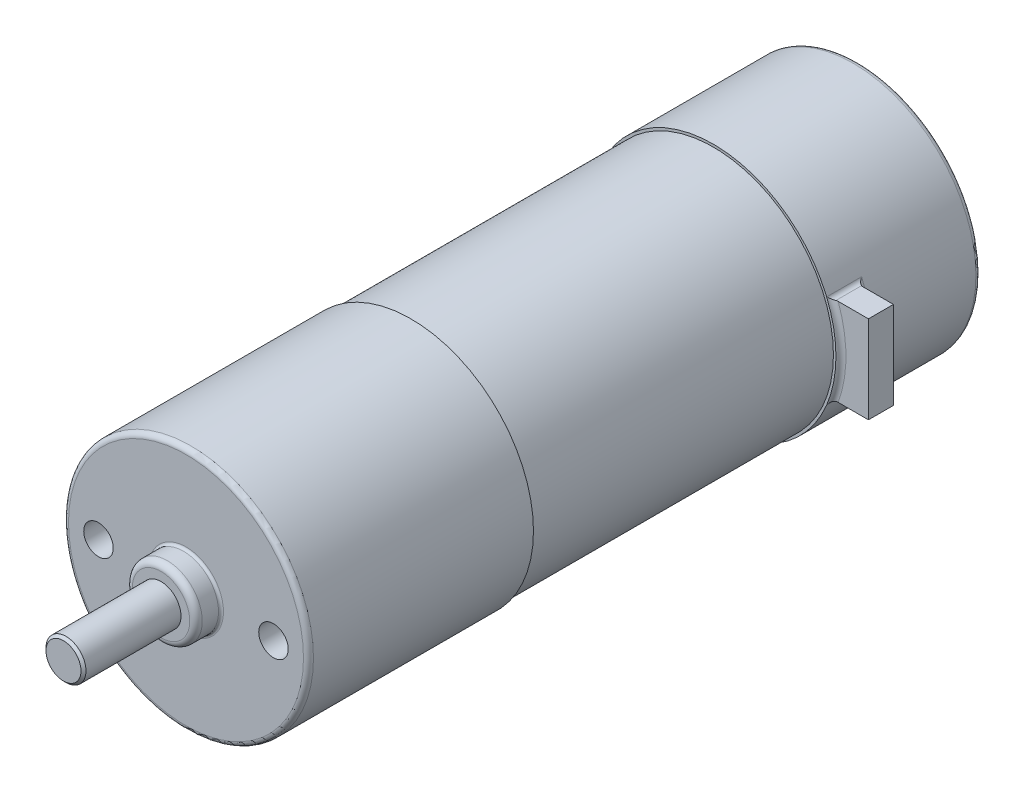
ISO-10303-21;
HEADER;
FILE_DESCRIPTION(('STEP AP214'),'2;1');
FILE_NAME('part.step','',(''),(''),'','','');
FILE_SCHEMA(('AUTOMOTIVE_DESIGN { 1 0 10303 214 1 1 1 1 }'));
ENDSEC;
DATA;
#1=APPLICATION_CONTEXT('core data for automotive mechanical design processes');
#2=APPLICATION_PROTOCOL_DEFINITION('international standard','automotive_design',2000,#1);
#3=PRODUCT_CONTEXT('',#1,'mechanical');
#4=PRODUCT('Part','Part','',(#3));
#5=PRODUCT_RELATED_PRODUCT_CATEGORY('part','',(#4));
#6=PRODUCT_DEFINITION_FORMATION('','',#4);
#7=PRODUCT_DEFINITION_CONTEXT('part definition',#1,'design');
#8=PRODUCT_DEFINITION('design','',#6,#7);
#9=PRODUCT_DEFINITION_SHAPE('','',#8);
#10=(LENGTH_UNIT() NAMED_UNIT(*) SI_UNIT(.MILLI.,.METRE.));
#11=(NAMED_UNIT(*) PLANE_ANGLE_UNIT() SI_UNIT($,.RADIAN.));
#12=(NAMED_UNIT(*) SI_UNIT($,.STERADIAN.) SOLID_ANGLE_UNIT());
#13=UNCERTAINTY_MEASURE_WITH_UNIT(LENGTH_MEASURE(1.E-05),#10,'distance_accuracy_value','');
#14=(GEOMETRIC_REPRESENTATION_CONTEXT(3) GLOBAL_UNCERTAINTY_ASSIGNED_CONTEXT((#13)) GLOBAL_UNIT_ASSIGNED_CONTEXT((#10,
#11,#12)) REPRESENTATION_CONTEXT('',''));
#15=CARTESIAN_POINT('',(0.,0.,0.));
#16=DIRECTION('',(0.,0.,1.));
#17=DIRECTION('',(1.,0.,0.));
#18=AXIS2_PLACEMENT_3D('',#15,#16,#17);
#19=CARTESIAN_POINT('',(0.,0.,-68.326));
#20=DIRECTION('',(0.,0.,1.));
#21=DIRECTION('',(-1.,0.,0.));
#22=AXIS2_PLACEMENT_3D('',#19,#20,#21);
#23=CYLINDRICAL_SURFACE('',#22,12.446);
#24=CARTESIAN_POINT('',(0.,0.,-53.594));
#25=DIRECTION('',(0.,0.,1.));
#26=DIRECTION('',(1.,0.,0.));
#27=AXIS2_PLACEMENT_3D('',#24,#25,#26);
#28=CIRCLE('',#27,12.446);
#29=CARTESIAN_POINT('',(11.5003075817149,4.75876470588235,-53.594));
#30=VERTEX_POINT('',#29);
#31=CARTESIAN_POINT('',(11.5003075817149,-4.75876470588235,-53.594));
#32=VERTEX_POINT('',#31);
#33=EDGE_CURVE('E163',#30,#32,#28,.T.);
#34=ORIENTED_EDGE('',*,*,#33,.F.);
#35=DIRECTION('',(0.,0.,1.));
#36=VECTOR('',#35,1.);
#37=CARTESIAN_POINT('',(11.5003075817149,4.75876470588235,-68.326));
#38=LINE('',#37,#36);
#39=CARTESIAN_POINT('',(11.5003075817149,4.75876470588235,-57.15));
#40=VERTEX_POINT('',#39);
#41=EDGE_CURVE('E213',#40,#30,#38,.T.);
#42=ORIENTED_EDGE('',*,*,#41,.F.);
#43=CARTESIAN_POINT('',(0.,0.,-57.15));
#44=DIRECTION('',(0.,0.,-1.));
#45=DIRECTION('',(-1.,0.,0.));
#46=AXIS2_PLACEMENT_3D('',#43,#44,#45);
#47=CIRCLE('',#46,12.446);
#48=CARTESIAN_POINT('',(11.5003075817149,-4.75876470588235,-57.15));
#49=VERTEX_POINT('',#48);
#50=EDGE_CURVE('E211',#49,#40,#47,.F.);
#51=ORIENTED_EDGE('',*,*,#50,.F.);
#52=DIRECTION('',(0.,0.,1.));
#53=VECTOR('',#52,1.);
#54=CARTESIAN_POINT('',(11.5003075817149,-4.75876470588235,-68.326));
#55=LINE('',#54,#53);
#56=EDGE_CURVE('E215',#32,#49,#55,.F.);
#57=ORIENTED_EDGE('',*,*,#56,.F.);
#58=EDGE_LOOP('',(#34,#42,#51,#57));
#59=FACE_BOUND('',#58,.T.);
#60=CARTESIAN_POINT('',(0.,0.,-67.818));
#61=DIRECTION('',(0.,0.,1.));
#62=DIRECTION('',(1.,0.,0.));
#63=AXIS2_PLACEMENT_3D('',#60,#61,#62);
#64=CIRCLE('',#63,12.446);
#65=CARTESIAN_POINT('',(12.446,0.,-67.818));
#66=VERTEX_POINT('',#65);
#67=EDGE_CURVE('E199',#66,#66,#64,.F.);
#68=ORIENTED_EDGE('',*,*,#67,.F.);
#69=EDGE_LOOP('',(#68));
#70=FACE_BOUND('',#69,.T.);
#71=ADVANCED_FACE('F45',(#59,#70),#23,.T.);
#72=CARTESIAN_POINT('',(0.,0.,-22.86));
#73=DIRECTION('',(0.,0.,1.));
#74=DIRECTION('',(-1.,0.,0.));
#75=AXIS2_PLACEMENT_3D('',#72,#73,#74);
#76=CYLINDRICAL_SURFACE('',#75,12.446);
#77=CARTESIAN_POINT('',(0.,0.,-0.508000000000002));
#78=DIRECTION('',(0.,0.,1.));
#79=DIRECTION('',(1.,0.,0.));
#80=AXIS2_PLACEMENT_3D('',#77,#78,#79);
#81=CIRCLE('',#80,12.446);
#82=CARTESIAN_POINT('',(12.446,0.,-0.508000000000002));
#83=VERTEX_POINT('',#82);
#84=EDGE_CURVE('E202',#83,#83,#81,.T.);
#85=ORIENTED_EDGE('',*,*,#84,.F.);
#86=EDGE_LOOP('',(#85));
#87=FACE_BOUND('',#86,.T.);
#88=CARTESIAN_POINT('',(0.,0.,-22.86));
#89=DIRECTION('',(0.,0.,1.));
#90=DIRECTION('',(1.,0.,0.));
#91=AXIS2_PLACEMENT_3D('',#88,#89,#90);
#92=CIRCLE('',#91,12.446);
#93=CARTESIAN_POINT('',(12.446,0.,-22.86));
#94=VERTEX_POINT('',#93);
#95=EDGE_CURVE('E170',#94,#94,#92,.T.);
#96=ORIENTED_EDGE('',*,*,#95,.T.);
#97=EDGE_LOOP('',(#96));
#98=FACE_BOUND('',#97,.T.);
#99=ADVANCED_FACE('F305',(#87,#98),#76,.T.);
#100=CARTESIAN_POINT('',(0.,0.,-22.86));
#101=DIRECTION('',(0.,0.,-1.));
#102=DIRECTION('',(1.,0.,0.));
#103=AXIS2_PLACEMENT_3D('',#100,#101,#102);
#104=PLANE('',#103);
#105=CARTESIAN_POINT('',(0.,0.,-22.86));
#106=DIRECTION('',(0.,0.,1.));
#107=DIRECTION('',(1.,0.,0.));
#108=AXIS2_PLACEMENT_3D('',#105,#106,#107);
#109=CIRCLE('',#108,12.192);
#110=CARTESIAN_POINT('',(12.192,0.,-22.86));
#111=VERTEX_POINT('',#110);
#112=EDGE_CURVE('E171',#111,#111,#109,.T.);
#113=ORIENTED_EDGE('',*,*,#112,.T.);
#114=EDGE_LOOP('',(#113));
#115=FACE_BOUND('',#114,.T.);
#116=ORIENTED_EDGE('',*,*,#95,.F.);
#117=EDGE_LOOP('',(#116));
#118=FACE_BOUND('',#117,.T.);
#119=ADVANCED_FACE('F311',(#115,#118),#104,.T.);
#120=CARTESIAN_POINT('',(0.,0.,0.));
#121=DIRECTION('',(0.,0.,-1.));
#122=DIRECTION('',(1.,0.,0.));
#123=AXIS2_PLACEMENT_3D('',#120,#121,#122);
#124=PLANE('',#123);
#125=CARTESIAN_POINT('',(8.89,0.,0.));
#126=DIRECTION('',(0.,0.,-1.));
#127=DIRECTION('',(-1.,0.,0.));
#128=AXIS2_PLACEMENT_3D('',#125,#126,#127);
#129=CIRCLE('',#128,1.5);
#130=CARTESIAN_POINT('',(7.39,0.,0.));
#131=VERTEX_POINT('',#130);
#132=EDGE_CURVE('E155',#131,#131,#129,.T.);
#133=ORIENTED_EDGE('',*,*,#132,.T.);
#134=EDGE_LOOP('',(#133));
#135=FACE_BOUND('',#134,.T.);
#136=CARTESIAN_POINT('',(-8.89,0.,0.));
#137=DIRECTION('',(0.,0.,-1.));
#138=DIRECTION('',(1.,0.,0.));
#139=AXIS2_PLACEMENT_3D('',#136,#137,#138);
#140=CIRCLE('',#139,1.5);
#141=CARTESIAN_POINT('',(-10.39,0.,0.));
#142=VERTEX_POINT('',#141);
#143=EDGE_CURVE('E158',#142,#142,#140,.T.);
#144=ORIENTED_EDGE('',*,*,#143,.T.);
#145=EDGE_LOOP('',(#144));
#146=FACE_BOUND('',#145,.T.);
#147=CARTESIAN_POINT('',(0.,0.,0.));
#148=DIRECTION('',(0.,0.,1.));
#149=DIRECTION('',(1.,0.,0.));
#150=AXIS2_PLACEMENT_3D('',#147,#148,#149);
#151=CIRCLE('',#150,11.938);
#152=CARTESIAN_POINT('',(11.938,0.,0.));
#153=VERTEX_POINT('',#152);
#154=EDGE_CURVE('E205',#153,#153,#151,.F.);
#155=ORIENTED_EDGE('',*,*,#154,.F.);
#156=EDGE_LOOP('',(#155));
#157=FACE_BOUND('',#156,.T.);
#158=CARTESIAN_POINT('',(0.,0.,0.));
#159=DIRECTION('',(0.,0.,1.));
#160=DIRECTION('',(1.,0.,0.));
#161=AXIS2_PLACEMENT_3D('',#158,#159,#160);
#162=CIRCLE('',#161,3.81);
#163=CARTESIAN_POINT('',(3.81,0.,0.));
#164=VERTEX_POINT('',#163);
#165=EDGE_CURVE('E193',#164,#164,#162,.T.);
#166=ORIENTED_EDGE('',*,*,#165,.F.);
#167=EDGE_LOOP('',(#166));
#168=FACE_BOUND('',#167,.T.);
#169=ADVANCED_FACE('F324',(#135,#146,#157,#168),#124,.F.);
#170=CARTESIAN_POINT('',(0.,0.,-53.594));
#171=DIRECTION('',(0.,0.,1.));
#172=DIRECTION('',(-1.,0.,0.));
#173=AXIS2_PLACEMENT_3D('',#170,#171,#172);
#174=CYLINDRICAL_SURFACE('',#173,12.192);
#175=CARTESIAN_POINT('',(0.,0.,-53.594));
#176=DIRECTION('',(0.,0.,1.));
#177=DIRECTION('',(1.,0.,0.));
#178=AXIS2_PLACEMENT_3D('',#175,#176,#177);
#179=CIRCLE('',#178,12.192);
#180=CARTESIAN_POINT('',(12.192,0.,-53.594));
#181=VERTEX_POINT('',#180);
#182=EDGE_CURVE('E166',#181,#181,#179,.T.);
#183=ORIENTED_EDGE('',*,*,#182,.T.);
#184=EDGE_LOOP('',(#183));
#185=FACE_BOUND('',#184,.T.);
#186=ORIENTED_EDGE('',*,*,#112,.F.);
#187=EDGE_LOOP('',(#186));
#188=FACE_BOUND('',#187,.T.);
#189=ADVANCED_FACE('F320',(#185,#188),#174,.T.);
#190=CARTESIAN_POINT('',(0.,0.,-68.326));
#191=DIRECTION('',(0.,0.,-1.));
#192=DIRECTION('',(1.,0.,0.));
#193=AXIS2_PLACEMENT_3D('',#190,#191,#192);
#194=PLANE('',#193);
#195=CARTESIAN_POINT('',(0.,0.,-68.326));
#196=DIRECTION('',(0.,0.,1.));
#197=DIRECTION('',(1.,0.,0.));
#198=AXIS2_PLACEMENT_3D('',#195,#196,#197);
#199=CIRCLE('',#198,11.938);
#200=CARTESIAN_POINT('',(11.938,0.,-68.326));
#201=VERTEX_POINT('',#200);
#202=EDGE_CURVE('E196',#201,#201,#199,.T.);
#203=ORIENTED_EDGE('',*,*,#202,.F.);
#204=EDGE_LOOP('',(#203));
#205=FACE_BOUND('',#204,.T.);
#206=ADVANCED_FACE('F323',(#205),#194,.T.);
#207=CARTESIAN_POINT('',(0.,0.,-53.594));
#208=DIRECTION('',(0.,0.,-1.));
#209=DIRECTION('',(1.,0.,0.));
#210=AXIS2_PLACEMENT_3D('',#207,#208,#209);
#211=PLANE('',#210);
#212=ORIENTED_EDGE('',*,*,#182,.F.);
#213=EDGE_LOOP('',(#212));
#214=FACE_BOUND('',#213,.T.);
#215=ORIENTED_EDGE('',*,*,#33,.T.);
#216=EDGE_CURVE('E167',#32,#30,#28,.T.);
#217=ORIENTED_EDGE('',*,*,#216,.T.);
#218=EDGE_LOOP('',(#215,#217));
#219=FACE_BOUND('',#218,.T.);
#220=ADVANCED_FACE('F318',(#214,#219),#211,.F.);
#221=CARTESIAN_POINT('',(0.,0.,2.54));
#222=DIRECTION('',(0.,0.,-1.));
#223=DIRECTION('',(1.,0.,0.));
#224=AXIS2_PLACEMENT_3D('',#221,#222,#223);
#225=CYLINDRICAL_SURFACE('',#224,3.556);
#226=CARTESIAN_POINT('',(0.,0.,0.254));
#227=DIRECTION('',(0.,0.,1.));
#228=DIRECTION('',(1.,0.,0.));
#229=AXIS2_PLACEMENT_3D('',#226,#227,#228);
#230=CIRCLE('',#229,3.556);
#231=CARTESIAN_POINT('',(3.556,0.,0.254));
#232=VERTEX_POINT('',#231);
#233=EDGE_CURVE('E190',#232,#232,#230,.F.);
#234=ORIENTED_EDGE('',*,*,#233,.F.);
#235=EDGE_LOOP('',(#234));
#236=FACE_BOUND('',#235,.T.);
#237=CARTESIAN_POINT('',(0.,0.,1.905));
#238=DIRECTION('',(0.,0.,-1.));
#239=DIRECTION('',(-1.,0.,0.));
#240=AXIS2_PLACEMENT_3D('',#237,#238,#239);
#241=CIRCLE('',#240,3.556);
#242=CARTESIAN_POINT('',(-3.556,0.,1.905));
#243=VERTEX_POINT('',#242);
#244=EDGE_CURVE('E187',#243,#243,#241,.F.);
#245=ORIENTED_EDGE('',*,*,#244,.F.);
#246=EDGE_LOOP('',(#245));
#247=FACE_BOUND('',#246,.T.);
#248=ADVANCED_FACE('F370',(#236,#247),#225,.T.);
#249=CARTESIAN_POINT('',(0.,0.,2.54));
#250=DIRECTION('',(0.,0.,1.));
#251=DIRECTION('',(-1.,0.,0.));
#252=AXIS2_PLACEMENT_3D('',#249,#250,#251);
#253=PLANE('',#252);
#254=CARTESIAN_POINT('',(0.,0.,2.54));
#255=DIRECTION('',(0.,0.,-1.));
#256=DIRECTION('',(-1.,0.,0.));
#257=AXIS2_PLACEMENT_3D('',#254,#255,#256);
#258=CIRCLE('',#257,2.921);
#259=CARTESIAN_POINT('',(-2.921,0.,2.54));
#260=VERTEX_POINT('',#259);
#261=EDGE_CURVE('E184',#260,#260,#258,.T.);
#262=ORIENTED_EDGE('',*,*,#261,.F.);
#263=EDGE_LOOP('',(#262));
#264=FACE_BOUND('',#263,.T.);
#265=CARTESIAN_POINT('',(0.,0.,2.54));
#266=DIRECTION('',(0.,0.,-1.));
#267=DIRECTION('',(-1.,0.,0.));
#268=AXIS2_PLACEMENT_3D('',#265,#266,#267);
#269=CIRCLE('',#268,2.032);
#270=CARTESIAN_POINT('',(-2.032,0.,2.54));
#271=VERTEX_POINT('',#270);
#272=EDGE_CURVE('E154',#271,#271,#269,.F.);
#273=ORIENTED_EDGE('',*,*,#272,.F.);
#274=EDGE_LOOP('',(#273));
#275=FACE_BOUND('',#274,.T.);
#276=ADVANCED_FACE('F373',(#264,#275),#253,.T.);
#277=CARTESIAN_POINT('',(0.,0.,12.446));
#278=DIRECTION('',(0.,0.,-1.));
#279=DIRECTION('',(1.,0.,0.));
#280=AXIS2_PLACEMENT_3D('',#277,#278,#279);
#281=CYLINDRICAL_SURFACE('',#280,2.032);
#282=CARTESIAN_POINT('',(0.,0.,12.192));
#283=DIRECTION('',(0.,0.,-1.));
#284=DIRECTION('',(-1.,0.,0.));
#285=AXIS2_PLACEMENT_3D('',#282,#283,#284);
#286=CIRCLE('',#285,2.032);
#287=CARTESIAN_POINT('',(-2.032,0.,12.192));
#288=VERTEX_POINT('',#287);
#289=EDGE_CURVE('E181',#288,#288,#286,.F.);
#290=ORIENTED_EDGE('',*,*,#289,.F.);
#291=EDGE_LOOP('',(#290));
#292=FACE_BOUND('',#291,.T.);
#293=ORIENTED_EDGE('',*,*,#272,.T.);
#294=EDGE_LOOP('',(#293));
#295=FACE_BOUND('',#294,.T.);
#296=ADVANCED_FACE('F381',(#292,#295),#281,.T.);
#297=CARTESIAN_POINT('',(0.,0.,12.446));
#298=DIRECTION('',(0.,0.,1.));
#299=DIRECTION('',(-1.,0.,0.));
#300=AXIS2_PLACEMENT_3D('',#297,#298,#299);
#301=PLANE('',#300);
#302=CARTESIAN_POINT('',(0.,0.,12.446));
#303=DIRECTION('',(0.,0.,-1.));
#304=DIRECTION('',(-1.,0.,0.));
#305=AXIS2_PLACEMENT_3D('',#302,#303,#304);
#306=CIRCLE('',#305,1.77799999999999);
#307=CARTESIAN_POINT('',(-1.77799999999999,0.,12.446));
#308=VERTEX_POINT('',#307);
#309=EDGE_CURVE('E174',#308,#308,#306,.T.);
#310=ORIENTED_EDGE('',*,*,#309,.F.);
#311=EDGE_LOOP('',(#310));
#312=FACE_BOUND('',#311,.T.);
#313=ADVANCED_FACE('F336',(#312),#301,.T.);
#314=CARTESIAN_POINT('',(0.,0.,12.446));
#315=DIRECTION('',(0.,0.,-1.));
#316=DIRECTION('',(1.,0.,0.));
#317=AXIS2_PLACEMENT_3D('',#314,#315,#316);
#318=CONICAL_SURFACE('',#317,1.77799999999999,0.785398163397464);
#319=ORIENTED_EDGE('',*,*,#289,.T.);
#320=EDGE_LOOP('',(#319));
#321=FACE_BOUND('',#320,.T.);
#322=ORIENTED_EDGE('',*,*,#309,.T.);
#323=EDGE_LOOP('',(#322));
#324=FACE_BOUND('',#323,.T.);
#325=ADVANCED_FACE('F332',(#321,#324),#318,.T.);
#326=CARTESIAN_POINT('',(0.,0.,1.905));
#327=DIRECTION('',(0.,0.,1.));
#328=DIRECTION('',(-1.,0.,0.));
#329=AXIS2_PLACEMENT_3D('',#326,#327,#328);
#330=TOROIDAL_SURFACE('',#329,2.921,0.635);
#331=ORIENTED_EDGE('',*,*,#244,.T.);
#332=EDGE_LOOP('',(#331));
#333=FACE_BOUND('',#332,.T.);
#334=ORIENTED_EDGE('',*,*,#261,.T.);
#335=EDGE_LOOP('',(#334));
#336=FACE_BOUND('',#335,.T.);
#337=ADVANCED_FACE('F335',(#333,#336),#330,.T.);
#338=CARTESIAN_POINT('',(0.,0.,0.254));
#339=DIRECTION('',(0.,0.,-1.));
#340=DIRECTION('',(1.,0.,0.));
#341=AXIS2_PLACEMENT_3D('',#338,#339,#340);
#342=TOROIDAL_SURFACE('',#341,3.81,0.254);
#343=ORIENTED_EDGE('',*,*,#165,.T.);
#344=EDGE_LOOP('',(#343));
#345=FACE_BOUND('',#344,.T.);
#346=ORIENTED_EDGE('',*,*,#233,.T.);
#347=EDGE_LOOP('',(#346));
#348=FACE_BOUND('',#347,.T.);
#349=ADVANCED_FACE('F340',(#345,#348),#342,.F.);
#350=CARTESIAN_POINT('',(0.,0.,-67.818));
#351=DIRECTION('',(0.,0.,-1.));
#352=DIRECTION('',(1.,0.,0.));
#353=AXIS2_PLACEMENT_3D('',#350,#351,#352);
#354=TOROIDAL_SURFACE('',#353,11.938,0.508);
#355=ORIENTED_EDGE('',*,*,#67,.T.);
#356=EDGE_LOOP('',(#355));
#357=FACE_BOUND('',#356,.T.);
#358=ORIENTED_EDGE('',*,*,#202,.T.);
#359=EDGE_LOOP('',(#358));
#360=FACE_BOUND('',#359,.T.);
#361=ADVANCED_FACE('F344',(#357,#360),#354,.T.);
#362=CARTESIAN_POINT('',(0.,0.,-0.508000000000002));
#363=DIRECTION('',(0.,0.,-1.));
#364=DIRECTION('',(1.,0.,0.));
#365=AXIS2_PLACEMENT_3D('',#362,#363,#364);
#366=TOROIDAL_SURFACE('',#365,11.938,0.508);
#367=ORIENTED_EDGE('',*,*,#154,.T.);
#368=EDGE_LOOP('',(#367));
#369=FACE_BOUND('',#368,.T.);
#370=ORIENTED_EDGE('',*,*,#84,.T.);
#371=EDGE_LOOP('',(#370));
#372=FACE_BOUND('',#371,.T.);
#373=ADVANCED_FACE('F347',(#369,#372),#366,.T.);
#374=CARTESIAN_POINT('',(-8.89,0.,-7.62));
#375=DIRECTION('',(0.,0.,1.));
#376=DIRECTION('',(-1.,0.,0.));
#377=AXIS2_PLACEMENT_3D('',#374,#375,#376);
#378=CYLINDRICAL_SURFACE('',#377,1.5);
#379=CARTESIAN_POINT('',(-8.89,0.,-7.62));
#380=DIRECTION('',(0.,0.,-1.));
#381=DIRECTION('',(1.,0.,0.));
#382=AXIS2_PLACEMENT_3D('',#379,#380,#381);
#383=CIRCLE('',#382,1.5);
#384=CARTESIAN_POINT('',(-10.39,0.,-7.62));
#385=VERTEX_POINT('',#384);
#386=EDGE_CURVE('E134',#385,#385,#383,.T.);
#387=CARTESIAN_POINT('',(-10.39,0.,-7.62));
#388=CARTESIAN_POINT('',(-10.39,0.,-7.540625));
#389=CARTESIAN_POINT('',(-10.39,0.,-7.46125));
#390=CARTESIAN_POINT('',(-10.39,0.,-7.3025));
#391=CARTESIAN_POINT('',(-10.39,0.,-7.223125));
#392=CARTESIAN_POINT('',(-10.39,0.,-7.064375));
#393=CARTESIAN_POINT('',(-10.39,0.,-6.985));
#394=CARTESIAN_POINT('',(-10.39,0.,-6.82625));
#395=CARTESIAN_POINT('',(-10.39,0.,-6.746875));
#396=CARTESIAN_POINT('',(-10.39,0.,-6.588125));
#397=CARTESIAN_POINT('',(-10.39,0.,-6.50875));
#398=CARTESIAN_POINT('',(-10.39,0.,-6.35));
#399=CARTESIAN_POINT('',(-10.39,0.,-6.270625));
#400=CARTESIAN_POINT('',(-10.39,0.,-6.111875));
#401=CARTESIAN_POINT('',(-10.39,0.,-6.0325));
#402=CARTESIAN_POINT('',(-10.39,0.,-5.87375));
#403=CARTESIAN_POINT('',(-10.39,0.,-5.794375));
#404=CARTESIAN_POINT('',(-10.39,0.,-5.635625));
#405=CARTESIAN_POINT('',(-10.39,0.,-5.55625));
#406=CARTESIAN_POINT('',(-10.39,0.,-5.3975));
#407=CARTESIAN_POINT('',(-10.39,0.,-5.318125));
#408=CARTESIAN_POINT('',(-10.39,0.,-5.159375));
#409=CARTESIAN_POINT('',(-10.39,0.,-5.08));
#410=CARTESIAN_POINT('',(-10.39,0.,-4.92125));
#411=CARTESIAN_POINT('',(-10.39,0.,-4.841875));
#412=CARTESIAN_POINT('',(-10.39,0.,-4.683125));
#413=CARTESIAN_POINT('',(-10.39,0.,-4.60375));
#414=CARTESIAN_POINT('',(-10.39,0.,-4.445));
#415=CARTESIAN_POINT('',(-10.39,0.,-4.365625));
#416=CARTESIAN_POINT('',(-10.39,0.,-4.206875));
#417=CARTESIAN_POINT('',(-10.39,0.,-4.1275));
#418=CARTESIAN_POINT('',(-10.39,0.,-3.96875));
#419=CARTESIAN_POINT('',(-10.39,0.,-3.889375));
#420=CARTESIAN_POINT('',(-10.39,0.,-3.730625));
#421=CARTESIAN_POINT('',(-10.39,0.,-3.65125));
#422=CARTESIAN_POINT('',(-10.39,0.,-3.4925));
#423=CARTESIAN_POINT('',(-10.39,0.,-3.413125));
#424=CARTESIAN_POINT('',(-10.39,0.,-3.254375));
#425=CARTESIAN_POINT('',(-10.39,0.,-3.175));
#426=CARTESIAN_POINT('',(-10.39,0.,-3.01625));
#427=CARTESIAN_POINT('',(-10.39,0.,-2.936875));
#428=CARTESIAN_POINT('',(-10.39,0.,-2.778125));
#429=CARTESIAN_POINT('',(-10.39,0.,-2.69875));
#430=CARTESIAN_POINT('',(-10.39,0.,-2.54));
#431=CARTESIAN_POINT('',(-10.39,0.,-2.460625));
#432=CARTESIAN_POINT('',(-10.39,0.,-2.301875));
#433=CARTESIAN_POINT('',(-10.39,0.,-2.2225));
#434=CARTESIAN_POINT('',(-10.39,0.,-2.06375));
#435=CARTESIAN_POINT('',(-10.39,0.,-1.984375));
#436=CARTESIAN_POINT('',(-10.39,0.,-1.825625));
#437=CARTESIAN_POINT('',(-10.39,0.,-1.74625));
#438=CARTESIAN_POINT('',(-10.39,0.,-1.5875));
#439=CARTESIAN_POINT('',(-10.39,0.,-1.508125));
#440=CARTESIAN_POINT('',(-10.39,0.,-1.349375));
#441=CARTESIAN_POINT('',(-10.39,0.,-1.27));
#442=CARTESIAN_POINT('',(-10.39,0.,-1.11125));
#443=CARTESIAN_POINT('',(-10.39,0.,-1.031875));
#444=CARTESIAN_POINT('',(-10.39,0.,-0.873125));
#445=CARTESIAN_POINT('',(-10.39,0.,-0.79375));
#446=CARTESIAN_POINT('',(-10.39,0.,-0.635));
#447=CARTESIAN_POINT('',(-10.39,0.,-0.555625));
#448=CARTESIAN_POINT('',(-10.39,0.,-0.396875));
#449=CARTESIAN_POINT('',(-10.39,0.,-0.3175));
#450=CARTESIAN_POINT('',(-10.39,0.,-0.15875));
#451=CARTESIAN_POINT('',(-10.39,0.,-0.0793749999999999));
#452=CARTESIAN_POINT('',(-10.39,0.,0.));
#453=B_SPLINE_CURVE_WITH_KNOTS('',3,(#387,#388,#389,#390,#391,#392,#393,#394,#395,#396,#397,
#398,#399,#400,#401,#402,#403,#404,#405,#406,#407,#408,#409,#410,#411,#412,#413,#414,#415,#416,
#417,#418,#419,#420,#421,#422,#423,#424,#425,#426,#427,#428,#429,#430,#431,#432,#433,#434,#435,
#436,#437,#438,#439,#440,#441,#442,#443,#444,#445,#446,#447,#448,#449,#450,#451,#452),
.UNSPECIFIED.,.F.,.F.,(4,2,2,2,2,2,2,2,2,2,2,2,2,2,2,2,2,2,2,2,2,2,2,2,2,2,2,2,2,2,2,2,4),(0.,
0.238125,0.476249999999999,0.714375,0.952499999999999,1.190625,1.42875,1.666875,1.905,2.143125,
2.38125,2.619375,2.8575,3.095625,3.33375,3.571875,3.81,4.048125,4.28625,4.524375,4.7625,
5.000625,5.23875,5.476875,5.715,5.953125,6.19125,6.429375,6.6675,6.905625,7.14375,7.381875,
7.62),.UNSPECIFIED.);
#454=EDGE_CURVE('BSEAM350',#385,#142,#453,.T.);
#455=ORIENTED_EDGE('',*,*,#386,.T.);
#456=ORIENTED_EDGE('',*,*,#143,.F.);
#457=ORIENTED_EDGE('',*,*,#454,.T.);
#458=ORIENTED_EDGE('',*,*,#454,.F.);
#459=EDGE_LOOP('',(#455,#457,#456,#458));
#460=FACE_BOUND('',#459,.T.);
#461=ADVANCED_FACE('F350',(#460),#378,.F.);
#462=CARTESIAN_POINT('',(-8.89,0.,-7.62));
#463=DIRECTION('',(0.,0.,-1.));
#464=DIRECTION('',(1.,0.,0.));
#465=AXIS2_PLACEMENT_3D('',#462,#463,#464);
#466=PLANE('',#465);
#467=ORIENTED_EDGE('',*,*,#386,.F.);
#468=EDGE_LOOP('',(#467));
#469=FACE_BOUND('',#468,.T.);
#470=ADVANCED_FACE('F355',(#469),#466,.F.);
#471=CARTESIAN_POINT('',(8.89,0.,-7.62));
#472=DIRECTION('',(0.,0.,1.));
#473=DIRECTION('',(-1.,0.,0.));
#474=AXIS2_PLACEMENT_3D('',#471,#472,#473);
#475=CYLINDRICAL_SURFACE('',#474,1.5);
#476=CARTESIAN_POINT('',(8.89,0.,-7.62));
#477=DIRECTION('',(0.,0.,-1.));
#478=DIRECTION('',(-1.,0.,0.));
#479=AXIS2_PLACEMENT_3D('',#476,#477,#478);
#480=CIRCLE('',#479,1.5);
#481=CARTESIAN_POINT('',(7.39,0.,-7.62));
#482=VERTEX_POINT('',#481);
#483=EDGE_CURVE('E151',#482,#482,#480,.T.);
#484=CARTESIAN_POINT('',(7.39,0.,-7.62));
#485=CARTESIAN_POINT('',(7.39,0.,-7.540625));
#486=CARTESIAN_POINT('',(7.39,0.,-7.46125));
#487=CARTESIAN_POINT('',(7.39,0.,-7.3025));
#488=CARTESIAN_POINT('',(7.39,0.,-7.223125));
#489=CARTESIAN_POINT('',(7.39,0.,-7.064375));
#490=CARTESIAN_POINT('',(7.39,0.,-6.985));
#491=CARTESIAN_POINT('',(7.39,0.,-6.82625));
#492=CARTESIAN_POINT('',(7.39,0.,-6.746875));
#493=CARTESIAN_POINT('',(7.39,0.,-6.588125));
#494=CARTESIAN_POINT('',(7.39,0.,-6.50875));
#495=CARTESIAN_POINT('',(7.39,0.,-6.35));
#496=CARTESIAN_POINT('',(7.39,0.,-6.270625));
#497=CARTESIAN_POINT('',(7.39,0.,-6.111875));
#498=CARTESIAN_POINT('',(7.39,0.,-6.0325));
#499=CARTESIAN_POINT('',(7.39,0.,-5.87375));
#500=CARTESIAN_POINT('',(7.39,0.,-5.794375));
#501=CARTESIAN_POINT('',(7.39,0.,-5.635625));
#502=CARTESIAN_POINT('',(7.39,0.,-5.55625));
#503=CARTESIAN_POINT('',(7.39,0.,-5.3975));
#504=CARTESIAN_POINT('',(7.39,0.,-5.318125));
#505=CARTESIAN_POINT('',(7.39,0.,-5.159375));
#506=CARTESIAN_POINT('',(7.39,0.,-5.08));
#507=CARTESIAN_POINT('',(7.39,0.,-4.92125));
#508=CARTESIAN_POINT('',(7.39,0.,-4.841875));
#509=CARTESIAN_POINT('',(7.39,0.,-4.683125));
#510=CARTESIAN_POINT('',(7.39,0.,-4.60375));
#511=CARTESIAN_POINT('',(7.39,0.,-4.445));
#512=CARTESIAN_POINT('',(7.39,0.,-4.365625));
#513=CARTESIAN_POINT('',(7.39,0.,-4.206875));
#514=CARTESIAN_POINT('',(7.39,0.,-4.1275));
#515=CARTESIAN_POINT('',(7.39,0.,-3.96875));
#516=CARTESIAN_POINT('',(7.39,0.,-3.889375));
#517=CARTESIAN_POINT('',(7.39,0.,-3.730625));
#518=CARTESIAN_POINT('',(7.39,0.,-3.65125));
#519=CARTESIAN_POINT('',(7.39,0.,-3.4925));
#520=CARTESIAN_POINT('',(7.39,0.,-3.413125));
#521=CARTESIAN_POINT('',(7.39,0.,-3.254375));
#522=CARTESIAN_POINT('',(7.39,0.,-3.175));
#523=CARTESIAN_POINT('',(7.39,0.,-3.01625));
#524=CARTESIAN_POINT('',(7.39,0.,-2.936875));
#525=CARTESIAN_POINT('',(7.39,0.,-2.778125));
#526=CARTESIAN_POINT('',(7.39,0.,-2.69875));
#527=CARTESIAN_POINT('',(7.39,0.,-2.54));
#528=CARTESIAN_POINT('',(7.39,0.,-2.460625));
#529=CARTESIAN_POINT('',(7.39,0.,-2.301875));
#530=CARTESIAN_POINT('',(7.39,0.,-2.2225));
#531=CARTESIAN_POINT('',(7.39,0.,-2.06375));
#532=CARTESIAN_POINT('',(7.39,0.,-1.984375));
#533=CARTESIAN_POINT('',(7.39,0.,-1.825625));
#534=CARTESIAN_POINT('',(7.39,0.,-1.74625));
#535=CARTESIAN_POINT('',(7.39,0.,-1.5875));
#536=CARTESIAN_POINT('',(7.39,0.,-1.508125));
#537=CARTESIAN_POINT('',(7.39,0.,-1.349375));
#538=CARTESIAN_POINT('',(7.39,0.,-1.27));
#539=CARTESIAN_POINT('',(7.39,0.,-1.11125));
#540=CARTESIAN_POINT('',(7.39,0.,-1.031875));
#541=CARTESIAN_POINT('',(7.39,0.,-0.873125));
#542=CARTESIAN_POINT('',(7.39,0.,-0.79375));
#543=CARTESIAN_POINT('',(7.39,0.,-0.635));
#544=CARTESIAN_POINT('',(7.39,0.,-0.555625));
#545=CARTESIAN_POINT('',(7.39,0.,-0.396875));
#546=CARTESIAN_POINT('',(7.39,0.,-0.3175));
#547=CARTESIAN_POINT('',(7.39,0.,-0.15875));
#548=CARTESIAN_POINT('',(7.39,0.,-0.0793749999999999));
#549=CARTESIAN_POINT('',(7.39,0.,0.));
#550=B_SPLINE_CURVE_WITH_KNOTS('',3,(#484,#485,#486,#487,#488,#489,#490,#491,#492,#493,#494,
#495,#496,#497,#498,#499,#500,#501,#502,#503,#504,#505,#506,#507,#508,#509,#510,#511,#512,#513,
#514,#515,#516,#517,#518,#519,#520,#521,#522,#523,#524,#525,#526,#527,#528,#529,#530,#531,#532,
#533,#534,#535,#536,#537,#538,#539,#540,#541,#542,#543,#544,#545,#546,#547,#548,#549),
.UNSPECIFIED.,.F.,.F.,(4,2,2,2,2,2,2,2,2,2,2,2,2,2,2,2,2,2,2,2,2,2,2,2,2,2,2,2,2,2,2,2,4),(0.,
0.238125,0.476249999999999,0.714375,0.952499999999999,1.190625,1.42875,1.666875,1.905,2.143125,
2.38125,2.619375,2.8575,3.095625,3.33375,3.571875,3.81,4.048125,4.28625,4.524375,4.7625,
5.000625,5.23875,5.476875,5.715,5.953125,6.19125,6.429375,6.6675,6.905625,7.14375,7.381875,
7.62),.UNSPECIFIED.);
#551=EDGE_CURVE('BSEAM451',#482,#131,#550,.T.);
#552=ORIENTED_EDGE('',*,*,#483,.T.);
#553=ORIENTED_EDGE('',*,*,#132,.F.);
#554=ORIENTED_EDGE('',*,*,#551,.T.);
#555=ORIENTED_EDGE('',*,*,#551,.F.);
#556=EDGE_LOOP('',(#552,#554,#553,#555));
#557=FACE_BOUND('',#556,.T.);
#558=ADVANCED_FACE('F451',(#557),#475,.F.);
#559=CARTESIAN_POINT('',(8.89,0.,-7.62));
#560=DIRECTION('',(0.,0.,1.));
#561=DIRECTION('',(-1.,0.,0.));
#562=AXIS2_PLACEMENT_3D('',#559,#560,#561);
#563=PLANE('',#562);
#564=ORIENTED_EDGE('',*,*,#483,.F.);
#565=EDGE_LOOP('',(#564));
#566=FACE_BOUND('',#565,.T.);
#567=ADVANCED_FACE('F248',(#566),#563,.T.);
#568=CARTESIAN_POINT('',(15.24,4.445,-56.642));
#569=DIRECTION('',(0.,-1.,0.));
#570=DIRECTION('',(0.,0.,1.));
#571=AXIS2_PLACEMENT_3D('',#568,#569,#570);
#572=PLANE('',#571);
#573=CARTESIAN_POINT('',(12.1675014279843,4.445,-54.102));
#574=CARTESIAN_POINT('',(12.1338096494499,4.445,-54.1020082594795));
#575=CARTESIAN_POINT('',(12.1001655613649,4.445,-54.0990415470574));
#576=CARTESIAN_POINT('',(12.0505457348276,4.445,-54.0902431488967));
#577=CARTESIAN_POINT('',(12.03417005634,4.445,-54.08659408182));
#578=CARTESIAN_POINT('',(12.0016779644083,4.445,-54.0778357234633));
#579=CARTESIAN_POINT('',(11.9855645429467,4.445,-54.072715337041));
#580=CARTESIAN_POINT('',(11.9697078911726,4.445,-54.0668795735051));
#581=B_SPLINE_CURVE_WITH_KNOTS('',3,(#573,#574,#575,#576,#577,#578,#579,#580),.UNSPECIFIED.,.F.,
.F.,(4,2,2,4),(0.,0.100835063375725,0.15110652724218,0.201767508163891),.UNSPECIFIED.);
#582=CARTESIAN_POINT('',(12.1675014279843,4.445,-54.102));
#583=VERTEX_POINT('',#582);
#584=CARTESIAN_POINT('',(11.9697078911726,4.445,-54.0668795735051));
#585=VERTEX_POINT('',#584);
#586=EDGE_CURVE('E223',#583,#585,#581,.T.);
#587=ORIENTED_EDGE('',*,*,#586,.F.);
#588=DIRECTION('',(-1.,0.,0.));
#589=VECTOR('',#588,1.);
#590=CARTESIAN_POINT('',(15.24,4.445,-54.102));
#591=LINE('',#590,#589);
#592=CARTESIAN_POINT('',(15.24,4.445,-54.102));
#593=VERTEX_POINT('',#592);
#594=EDGE_CURVE('E140',#593,#583,#591,.T.);
#595=ORIENTED_EDGE('',*,*,#594,.F.);
#596=DIRECTION('',(0.,0.,-1.));
#597=VECTOR('',#596,1.);
#598=CARTESIAN_POINT('',(15.24,4.445,-56.642));
#599=LINE('',#598,#597);
#600=CARTESIAN_POINT('',(15.24,4.445,-56.642));
#601=VERTEX_POINT('',#600);
#602=EDGE_CURVE('E120',#593,#601,#599,.T.);
#603=ORIENTED_EDGE('',*,*,#602,.T.);
#604=DIRECTION('',(-1.,0.,0.));
#605=VECTOR('',#604,1.);
#606=CARTESIAN_POINT('',(15.24,4.445,-56.642));
#607=LINE('',#606,#605);
#608=CARTESIAN_POINT('',(12.1675014279843,4.445,-56.642));
#609=VERTEX_POINT('',#608);
#610=EDGE_CURVE('E129',#601,#609,#607,.T.);
#611=ORIENTED_EDGE('',*,*,#610,.T.);
#612=CARTESIAN_POINT('',(11.9697078911726,4.445,-56.6771204264949));
#613=CARTESIAN_POINT('',(11.9855645429467,4.445,-56.671284662959));
#614=CARTESIAN_POINT('',(12.0016779644083,4.445,-56.6661642765367));
#615=CARTESIAN_POINT('',(12.03417005634,4.445,-56.65740591818));
#616=CARTESIAN_POINT('',(12.0505457348276,4.445,-56.6537568511033));
#617=CARTESIAN_POINT('',(12.1001655613649,4.445,-56.6449584529426));
#618=CARTESIAN_POINT('',(12.1338096494499,4.445,-56.6419917405205));
#619=CARTESIAN_POINT('',(12.1675014279843,4.445,-56.642));
#620=B_SPLINE_CURVE_WITH_KNOTS('',3,(#612,#613,#614,#615,#616,#617,#618,#619),.UNSPECIFIED.,.F.,
.F.,(4,2,2,4),(0.,0.0506609809217117,0.100932444788166,0.201767508163893),.UNSPECIFIED.);
#621=CARTESIAN_POINT('',(11.9697078911726,4.445,-56.6771204264949));
#622=VERTEX_POINT('',#621);
#623=EDGE_CURVE('E11',#622,#609,#620,.T.);
#624=ORIENTED_EDGE('',*,*,#623,.F.);
#625=DIRECTION('',(0.,0.,-1.));
#626=VECTOR('',#625,1.);
#627=CARTESIAN_POINT('',(11.9697078911726,4.445,-56.642));
#628=LINE('',#627,#626);
#629=EDGE_CURVE('E220',#585,#622,#628,.T.);
#630=ORIENTED_EDGE('',*,*,#629,.F.);
#631=EDGE_LOOP('',(#587,#595,#603,#611,#624,#630));
#632=FACE_BOUND('',#631,.T.);
#633=ADVANCED_FACE('F138',(#632),#572,.F.);
#634=CARTESIAN_POINT('',(15.24,-4.445,-54.102));
#635=DIRECTION('',(0.,1.,0.));
#636=DIRECTION('',(0.,0.,-1.));
#637=AXIS2_PLACEMENT_3D('',#634,#635,#636);
#638=PLANE('',#637);
#639=DIRECTION('',(-1.,0.,0.));
#640=VECTOR('',#639,1.);
#641=CARTESIAN_POINT('',(15.24,-4.445,-56.642));
#642=LINE('',#641,#640);
#643=CARTESIAN_POINT('',(15.24,-4.445,-56.642));
#644=VERTEX_POINT('',#643);
#645=CARTESIAN_POINT('',(12.1675014279843,-4.445,-56.642));
#646=VERTEX_POINT('',#645);
#647=EDGE_CURVE('E135',#644,#646,#642,.T.);
#648=ORIENTED_EDGE('',*,*,#647,.F.);
#649=DIRECTION('',(0.,0.,1.));
#650=VECTOR('',#649,1.);
#651=CARTESIAN_POINT('',(15.24,-4.445,-54.102));
#652=LINE('',#651,#650);
#653=CARTESIAN_POINT('',(15.24,-4.445,-54.102));
#654=VERTEX_POINT('',#653);
#655=EDGE_CURVE('E123',#644,#654,#652,.T.);
#656=ORIENTED_EDGE('',*,*,#655,.T.);
#657=DIRECTION('',(-1.,0.,0.));
#658=VECTOR('',#657,1.);
#659=CARTESIAN_POINT('',(15.24,-4.445,-54.102));
#660=LINE('',#659,#658);
#661=CARTESIAN_POINT('',(12.1675014279843,-4.445,-54.102));
#662=VERTEX_POINT('',#661);
#663=EDGE_CURVE('E147',#654,#662,#660,.T.);
#664=ORIENTED_EDGE('',*,*,#663,.T.);
#665=CARTESIAN_POINT('',(11.9697078911726,-4.445,-54.0668795735051));
#666=CARTESIAN_POINT('',(11.9855645429467,-4.445,-54.072715337041));
#667=CARTESIAN_POINT('',(12.0016779644083,-4.445,-54.0778357234633));
#668=CARTESIAN_POINT('',(12.03417005634,-4.445,-54.08659408182));
#669=CARTESIAN_POINT('',(12.0505457348276,-4.445,-54.0902431488967));
#670=CARTESIAN_POINT('',(12.1001655613649,-4.445,-54.0990415470574));
#671=CARTESIAN_POINT('',(12.1338096494499,-4.445,-54.1020082594795));
#672=CARTESIAN_POINT('',(12.1675014279843,-4.445,-54.102));
#673=B_SPLINE_CURVE_WITH_KNOTS('',3,(#665,#666,#667,#668,#669,#670,#671,#672),.UNSPECIFIED.,.F.,
.F.,(4,2,2,4),(0.,0.0506609809217133,0.100932444788166,0.201767508163893),.UNSPECIFIED.);
#674=CARTESIAN_POINT('',(11.9697078911726,-4.445,-54.0668795735051));
#675=VERTEX_POINT('',#674);
#676=EDGE_CURVE('E232',#675,#662,#673,.T.);
#677=ORIENTED_EDGE('',*,*,#676,.F.);
#678=DIRECTION('',(0.,0.,-1.));
#679=VECTOR('',#678,1.);
#680=CARTESIAN_POINT('',(11.9697078911726,-4.445,-54.102));
#681=LINE('',#680,#679);
#682=CARTESIAN_POINT('',(11.9697078911726,-4.445,-56.6771204264949));
#683=VERTEX_POINT('',#682);
#684=EDGE_CURVE('E208',#683,#675,#681,.F.);
#685=ORIENTED_EDGE('',*,*,#684,.F.);
#686=CARTESIAN_POINT('',(12.1675014279843,-4.445,-56.642));
#687=CARTESIAN_POINT('',(12.1338096494499,-4.445,-56.6419917405205));
#688=CARTESIAN_POINT('',(12.1001655613649,-4.445,-56.6449584529426));
#689=CARTESIAN_POINT('',(12.0505457348276,-4.445,-56.6537568511033));
#690=CARTESIAN_POINT('',(12.03417005634,-4.445,-56.65740591818));
#691=CARTESIAN_POINT('',(12.0016779644083,-4.445,-56.6661642765367));
#692=CARTESIAN_POINT('',(11.9855645429467,-4.445,-56.671284662959));
#693=CARTESIAN_POINT('',(11.9697078911726,-4.445,-56.6771204264949));
#694=B_SPLINE_CURVE_WITH_KNOTS('',3,(#686,#687,#688,#689,#690,#691,#692,#693),.UNSPECIFIED.,.F.,
.F.,(4,2,2,4),(0.,0.100835063375725,0.15110652724218,0.201767508163891),.UNSPECIFIED.);
#695=EDGE_CURVE('E59',#646,#683,#694,.T.);
#696=ORIENTED_EDGE('',*,*,#695,.F.);
#697=EDGE_LOOP('',(#648,#656,#664,#677,#685,#696));
#698=FACE_BOUND('',#697,.T.);
#699=ADVANCED_FACE('F247',(#698),#638,.F.);
#700=CARTESIAN_POINT('',(15.24,-4.445,-56.642));
#701=DIRECTION('',(0.,0.,1.));
#702=DIRECTION('',(-1.,0.,0.));
#703=AXIS2_PLACEMENT_3D('',#700,#701,#702);
#704=PLANE('',#703);
#705=ORIENTED_EDGE('',*,*,#610,.F.);
#706=DIRECTION('',(0.,-1.,0.));
#707=VECTOR('',#706,1.);
#708=CARTESIAN_POINT('',(15.24,-4.445,-56.642));
#709=LINE('',#708,#707);
#710=EDGE_CURVE('E116',#601,#644,#709,.T.);
#711=ORIENTED_EDGE('',*,*,#710,.T.);
#712=ORIENTED_EDGE('',*,*,#647,.T.);
#713=CARTESIAN_POINT('',(0.,0.,-56.642));
#714=DIRECTION('',(0.,0.,-1.));
#715=DIRECTION('',(-1.,0.,0.));
#716=AXIS2_PLACEMENT_3D('',#713,#714,#715);
#717=CIRCLE('',#716,12.954);
#718=EDGE_CURVE('E131',#609,#646,#717,.T.);
#719=ORIENTED_EDGE('',*,*,#718,.F.);
#720=EDGE_LOOP('',(#705,#711,#712,#719));
#721=FACE_BOUND('',#720,.T.);
#722=ADVANCED_FACE('F130',(#721),#704,.F.);
#723=CARTESIAN_POINT('',(15.24,4.445,-54.102));
#724=DIRECTION('',(0.,0.,-1.));
#725=DIRECTION('',(1.,0.,0.));
#726=AXIS2_PLACEMENT_3D('',#723,#724,#725);
#727=PLANE('',#726);
#728=ORIENTED_EDGE('',*,*,#663,.F.);
#729=DIRECTION('',(0.,1.,0.));
#730=VECTOR('',#729,1.);
#731=CARTESIAN_POINT('',(15.24,4.445,-54.102));
#732=LINE('',#731,#730);
#733=EDGE_CURVE('E144',#654,#593,#732,.T.);
#734=ORIENTED_EDGE('',*,*,#733,.T.);
#735=ORIENTED_EDGE('',*,*,#594,.T.);
#736=CARTESIAN_POINT('',(0.,0.,-54.102));
#737=DIRECTION('',(0.,0.,1.));
#738=DIRECTION('',(1.,0.,0.));
#739=AXIS2_PLACEMENT_3D('',#736,#737,#738);
#740=CIRCLE('',#739,12.954);
#741=EDGE_CURVE('E218',#662,#583,#740,.T.);
#742=ORIENTED_EDGE('',*,*,#741,.F.);
#743=EDGE_LOOP('',(#728,#734,#735,#742));
#744=FACE_BOUND('',#743,.T.);
#745=ADVANCED_FACE('F296',(#744),#727,.F.);
#746=CARTESIAN_POINT('',(15.24,0.,0.));
#747=DIRECTION('',(-1.,0.,0.));
#748=DIRECTION('',(0.,0.,-1.));
#749=AXIS2_PLACEMENT_3D('',#746,#747,#748);
#750=PLANE('',#749);
#751=ORIENTED_EDGE('',*,*,#602,.F.);
#752=ORIENTED_EDGE('',*,*,#733,.F.);
#753=ORIENTED_EDGE('',*,*,#655,.F.);
#754=ORIENTED_EDGE('',*,*,#710,.F.);
#755=EDGE_LOOP('',(#751,#752,#753,#754));
#756=FACE_BOUND('',#755,.T.);
#757=ADVANCED_FACE('F118',(#756),#750,.F.);
#758=CARTESIAN_POINT('',(11.9697078911726,4.953,-68.326));
#759=DIRECTION('',(0.,0.,1.));
#760=DIRECTION('',(-1.,0.,0.));
#761=AXIS2_PLACEMENT_3D('',#758,#759,#760);
#762=CYLINDRICAL_SURFACE('',#761,0.508);
#763=CARTESIAN_POINT('',(11.9697078911726,4.445,-54.0668795735051));
#764=CARTESIAN_POINT('',(11.9408425973385,4.44500995524358,-54.0562525866537));
#765=CARTESIAN_POINT('',(11.9129247359652,4.44745399915281,-54.0436525992354));
#766=CARTESIAN_POINT('',(11.8596552827293,4.45633748293384,-54.0155722456913));
#767=CARTESIAN_POINT('',(11.8342772536288,4.46272934639827,-54.0001276933587));
#768=CARTESIAN_POINT('',(11.7791693457057,4.48095369942139,-53.9624143255504));
#769=CARTESIAN_POINT('',(11.7502688245152,4.49381905673644,-53.9394567109605));
#770=CARTESIAN_POINT('',(11.6965602630516,4.52357845200333,-53.8911698057857));
#771=CARTESIAN_POINT('',(11.6717809303555,4.54049889650659,-53.8658256598655));
#772=CARTESIAN_POINT('',(11.6155092042549,4.58627895280724,-53.8012261072691));
#773=CARTESIAN_POINT('',(11.5864882408832,4.61697478279764,-53.7611231620177));
#774=CARTESIAN_POINT('',(11.537349280976,4.68314723172282,-53.6797307383132));
#775=CARTESIAN_POINT('',(11.5172052948288,4.71860949246567,-53.638445105611));
#776=CARTESIAN_POINT('',(11.5011149230553,4.75682221529367,-53.5961460832419));
#777=CARTESIAN_POINT('',(11.500709740173,4.75779286289277,-53.5950730151354));
#778=CARTESIAN_POINT('',(11.5003075817149,4.75876470588235,-53.594));
#779=B_SPLINE_CURVE_WITH_KNOTS('',3,(#763,#764,#765,#766,#767,#768,#769,#770,#771,#772,#773,
#774,#775,#776,#777,#778),.UNSPECIFIED.,.F.,.F.,(4,2,2,2,2,2,2,4),(0.,0.0918040174307876,
0.182522699284828,0.299170542534457,0.416599681836559,0.590288352521688,0.763465070996823,
0.767972852717574),.UNSPECIFIED.);
#780=EDGE_CURVE('E72',#30,#585,#779,.F.);
#781=ORIENTED_EDGE('',*,*,#780,.T.);
#782=ORIENTED_EDGE('',*,*,#629,.T.);
#783=CARTESIAN_POINT('',(11.9697078911726,4.445,-56.6771204264949));
#784=CARTESIAN_POINT('',(11.9408425973385,4.44500995524358,-56.6877474133463));
#785=CARTESIAN_POINT('',(11.9129247359652,4.44745399915281,-56.7003474007645));
#786=CARTESIAN_POINT('',(11.8596552827293,4.45633748293384,-56.7284277543087));
#787=CARTESIAN_POINT('',(11.8342772536288,4.46272934639827,-56.7438723066413));
#788=CARTESIAN_POINT('',(11.7791693457057,4.48095369942139,-56.7815856744496));
#789=CARTESIAN_POINT('',(11.7502688245152,4.49381905673644,-56.8045432890395));
#790=CARTESIAN_POINT('',(11.6965602630516,4.52357845200333,-56.8528301942143));
#791=CARTESIAN_POINT('',(11.6717809303555,4.54049889650659,-56.8781743401345));
#792=CARTESIAN_POINT('',(11.6155092042549,4.58627895280724,-56.9427738927309));
#793=CARTESIAN_POINT('',(11.5864882408832,4.61697478279764,-56.9828768379822));
#794=CARTESIAN_POINT('',(11.537349280976,4.68314723172282,-57.0642692616868));
#795=CARTESIAN_POINT('',(11.5172052948288,4.71860949246567,-57.105554894389));
#796=CARTESIAN_POINT('',(11.5011149230553,4.75682221529367,-57.1478539167581));
#797=CARTESIAN_POINT('',(11.500709740173,4.75779286289277,-57.1489269848646));
#798=CARTESIAN_POINT('',(11.5003075817149,4.75876470588235,-57.15));
#799=B_SPLINE_CURVE_WITH_KNOTS('',3,(#783,#784,#785,#786,#787,#788,#789,#790,#791,#792,#793,
#794,#795,#796,#797,#798),.UNSPECIFIED.,.F.,.F.,(4,2,2,2,2,2,2,4),(0.,0.0918040174307876,
0.182522699284828,0.299170542534457,0.416599681836559,0.590288352521681,0.763465070996823,
0.767972852717574),.UNSPECIFIED.);
#800=EDGE_CURVE('E50',#622,#40,#799,.T.);
#801=ORIENTED_EDGE('',*,*,#800,.T.);
#802=ORIENTED_EDGE('',*,*,#41,.T.);
#803=EDGE_LOOP('',(#781,#782,#801,#802));
#804=FACE_BOUND('',#803,.T.);
#805=ADVANCED_FACE('F47',(#804),#762,.F.);
#806=CARTESIAN_POINT('',(0.,0.,-57.15));
#807=DIRECTION('',(0.,0.,1.));
#808=DIRECTION('',(-1.,0.,0.));
#809=AXIS2_PLACEMENT_3D('',#806,#807,#808);
#810=TOROIDAL_SURFACE('',#809,12.954,0.508);
#811=ORIENTED_EDGE('',*,*,#800,.F.);
#812=ORIENTED_EDGE('',*,*,#623,.T.);
#813=ORIENTED_EDGE('',*,*,#718,.T.);
#814=ORIENTED_EDGE('',*,*,#695,.T.);
#815=CARTESIAN_POINT('',(11.9697078911726,-4.445,-56.6771204264949));
#816=CARTESIAN_POINT('',(11.9408425973385,-4.44500995524358,-56.6877474133463));
#817=CARTESIAN_POINT('',(11.9129247359652,-4.44745399915281,-56.7003474007645));
#818=CARTESIAN_POINT('',(11.8596552827293,-4.45633748293384,-56.7284277543087));
#819=CARTESIAN_POINT('',(11.8342772536288,-4.46272934639827,-56.7438723066413));
#820=CARTESIAN_POINT('',(11.7791693457057,-4.48095369942139,-56.7815856744496));
#821=CARTESIAN_POINT('',(11.7502688245152,-4.49381905673644,-56.8045432890395));
#822=CARTESIAN_POINT('',(11.6965602630516,-4.52357845200333,-56.8528301942143));
#823=CARTESIAN_POINT('',(11.6717809303555,-4.54049889650659,-56.8781743401345));
#824=CARTESIAN_POINT('',(11.6155092042549,-4.58627895280724,-56.9427738927309));
#825=CARTESIAN_POINT('',(11.5864882408832,-4.61697478279764,-56.9828768379822));
#826=CARTESIAN_POINT('',(11.537349280976,-4.68314723172282,-57.0642692616868));
#827=CARTESIAN_POINT('',(11.5172052948288,-4.71860949246567,-57.105554894389));
#828=CARTESIAN_POINT('',(11.5011149230553,-4.75682221529367,-57.1478539167581));
#829=CARTESIAN_POINT('',(11.500709740173,-4.75779286289277,-57.1489269848646));
#830=CARTESIAN_POINT('',(11.5003075817149,-4.75876470588235,-57.15));
#831=B_SPLINE_CURVE_WITH_KNOTS('',3,(#815,#816,#817,#818,#819,#820,#821,#822,#823,#824,#825,
#826,#827,#828,#829,#830),.UNSPECIFIED.,.F.,.F.,(4,2,2,2,2,2,2,4),(0.,0.0918040174307876,
0.182522699284828,0.299170542534457,0.416599681836559,0.590288352521681,0.763465070996823,
0.767972852717574),.UNSPECIFIED.);
#832=EDGE_CURVE('E273',#683,#49,#831,.T.);
#833=ORIENTED_EDGE('',*,*,#832,.T.);
#834=ORIENTED_EDGE('',*,*,#50,.T.);
#835=EDGE_LOOP('',(#811,#812,#813,#814,#833,#834));
#836=FACE_BOUND('',#835,.T.);
#837=ADVANCED_FACE('F266',(#836),#810,.F.);
#838=CARTESIAN_POINT('',(0.,0.,-53.594));
#839=DIRECTION('',(0.,0.,-1.));
#840=DIRECTION('',(1.,0.,0.));
#841=AXIS2_PLACEMENT_3D('',#838,#839,#840);
#842=TOROIDAL_SURFACE('',#841,12.954,0.508);
#843=ORIENTED_EDGE('',*,*,#741,.T.);
#844=ORIENTED_EDGE('',*,*,#586,.T.);
#845=ORIENTED_EDGE('',*,*,#780,.F.);
#846=ORIENTED_EDGE('',*,*,#216,.F.);
#847=CARTESIAN_POINT('',(11.9697078911726,-4.445,-54.0668795735051));
#848=CARTESIAN_POINT('',(11.9408425973385,-4.44500995524358,-54.0562525866537));
#849=CARTESIAN_POINT('',(11.9129247359652,-4.44745399915281,-54.0436525992354));
#850=CARTESIAN_POINT('',(11.8596552827293,-4.45633748293384,-54.0155722456913));
#851=CARTESIAN_POINT('',(11.8342772536288,-4.46272934639827,-54.0001276933587));
#852=CARTESIAN_POINT('',(11.7791693457057,-4.48095369942139,-53.9624143255504));
#853=CARTESIAN_POINT('',(11.7502688245152,-4.49381905673644,-53.9394567109605));
#854=CARTESIAN_POINT('',(11.6965602630516,-4.52357845200333,-53.8911698057857));
#855=CARTESIAN_POINT('',(11.6717809303555,-4.54049889650659,-53.8658256598655));
#856=CARTESIAN_POINT('',(11.6155092042549,-4.58627895280724,-53.8012261072691));
#857=CARTESIAN_POINT('',(11.5864882408832,-4.61697478279764,-53.7611231620177));
#858=CARTESIAN_POINT('',(11.537349280976,-4.68314723172282,-53.6797307383132));
#859=CARTESIAN_POINT('',(11.5172052948288,-4.71860949246567,-53.638445105611));
#860=CARTESIAN_POINT('',(11.5011149230553,-4.75682221529367,-53.5961460832419));
#861=CARTESIAN_POINT('',(11.500709740173,-4.75779286289277,-53.5950730151354));
#862=CARTESIAN_POINT('',(11.5003075817149,-4.75876470588235,-53.594));
#863=B_SPLINE_CURVE_WITH_KNOTS('',3,(#847,#848,#849,#850,#851,#852,#853,#854,#855,#856,#857,
#858,#859,#860,#861,#862),.UNSPECIFIED.,.F.,.F.,(4,2,2,2,2,2,2,4),(0.,0.0918040174307876,
0.182522699284828,0.299170542534457,0.416599681836559,0.590288352521688,0.763465070996823,
0.767972852717574),.UNSPECIFIED.);
#864=EDGE_CURVE('E260',#32,#675,#863,.F.);
#865=ORIENTED_EDGE('',*,*,#864,.T.);
#866=ORIENTED_EDGE('',*,*,#676,.T.);
#867=EDGE_LOOP('',(#843,#844,#845,#846,#865,#866));
#868=FACE_BOUND('',#867,.T.);
#869=ADVANCED_FACE('F239',(#868),#842,.F.);
#870=CARTESIAN_POINT('',(11.9697078911726,-4.953,-68.326));
#871=DIRECTION('',(0.,0.,1.));
#872=DIRECTION('',(-1.,0.,0.));
#873=AXIS2_PLACEMENT_3D('',#870,#871,#872);
#874=CYLINDRICAL_SURFACE('',#873,0.508);
#875=ORIENTED_EDGE('',*,*,#832,.F.);
#876=ORIENTED_EDGE('',*,*,#684,.T.);
#877=ORIENTED_EDGE('',*,*,#864,.F.);
#878=ORIENTED_EDGE('',*,*,#56,.T.);
#879=EDGE_LOOP('',(#875,#876,#877,#878));
#880=FACE_BOUND('',#879,.T.);
#881=ADVANCED_FACE('F269',(#880),#874,.F.);
#882=CLOSED_SHELL('',(#71,#99,#119,#169,#189,#206,#220,#248,#276,#296,#313,#325,#337,#349,#361,
#373,#461,#470,#558,#567,#633,#699,#722,#745,#757,#805,#837,#869,#881));
#883=MANIFOLD_SOLID_BREP('B2',#882);
#884=ADVANCED_BREP_SHAPE_REPRESENTATION('',(#18,#883),#14);
#885=SHAPE_DEFINITION_REPRESENTATION(#9,#884);
ENDSEC;
END-ISO-10303-21;
